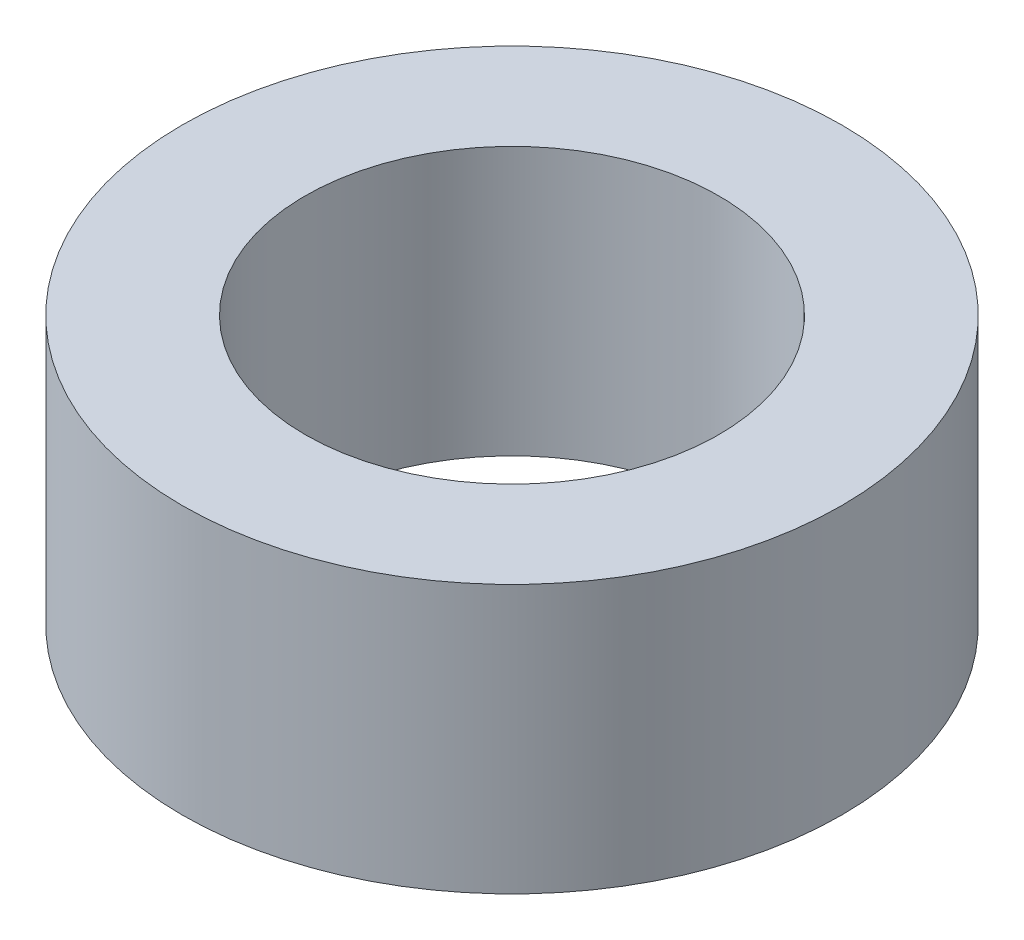
ISO-10303-21;
HEADER;
FILE_DESCRIPTION(('STEP AP214'),'2;1');
FILE_NAME('part.step','',(''),(''),'','','');
FILE_SCHEMA(('AUTOMOTIVE_DESIGN { 1 0 10303 214 1 1 1 1 }'));
ENDSEC;
DATA;
#1=APPLICATION_CONTEXT('core data for automotive mechanical design processes');
#2=APPLICATION_PROTOCOL_DEFINITION('international standard','automotive_design',2000,#1);
#3=PRODUCT_CONTEXT('',#1,'mechanical');
#4=PRODUCT('Part','Part','',(#3));
#5=PRODUCT_RELATED_PRODUCT_CATEGORY('part','',(#4));
#6=PRODUCT_DEFINITION_FORMATION('','',#4);
#7=PRODUCT_DEFINITION_CONTEXT('part definition',#1,'design');
#8=PRODUCT_DEFINITION('design','',#6,#7);
#9=PRODUCT_DEFINITION_SHAPE('','',#8);
#10=(LENGTH_UNIT() NAMED_UNIT(*) SI_UNIT(.MILLI.,.METRE.));
#11=(NAMED_UNIT(*) PLANE_ANGLE_UNIT() SI_UNIT($,.RADIAN.));
#12=(NAMED_UNIT(*) SI_UNIT($,.STERADIAN.) SOLID_ANGLE_UNIT());
#13=UNCERTAINTY_MEASURE_WITH_UNIT(LENGTH_MEASURE(1.E-05),#10,'distance_accuracy_value','');
#14=(GEOMETRIC_REPRESENTATION_CONTEXT(3) GLOBAL_UNCERTAINTY_ASSIGNED_CONTEXT((#13)) GLOBAL_UNIT_ASSIGNED_CONTEXT((#10,
#11,#12)) REPRESENTATION_CONTEXT('',''));
#15=CARTESIAN_POINT('',(0.,0.,0.));
#16=DIRECTION('',(0.,0.,1.));
#17=DIRECTION('',(1.,0.,0.));
#18=AXIS2_PLACEMENT_3D('',#15,#16,#17);
#19=CARTESIAN_POINT('',(0.,3.,0.));
#20=DIRECTION('',(0.,-1.,0.));
#21=DIRECTION('',(0.,0.,-1.));
#22=AXIS2_PLACEMENT_3D('',#19,#20,#21);
#23=CYLINDRICAL_SURFACE('',#22,3.69);
#24=CARTESIAN_POINT('',(0.,3.,0.));
#25=DIRECTION('',(0.,1.,0.));
#26=DIRECTION('',(0.,0.,1.));
#27=AXIS2_PLACEMENT_3D('',#24,#25,#26);
#28=CIRCLE('',#27,3.69);
#29=CARTESIAN_POINT('',(0.,3.,3.69));
#30=VERTEX_POINT('',#29);
#31=EDGE_CURVE('E10',#30,#30,#28,.T.);
#32=ORIENTED_EDGE('',*,*,#31,.F.);
#33=EDGE_LOOP('',(#32));
#34=FACE_BOUND('',#33,.T.);
#35=CARTESIAN_POINT('',(0.,0.,0.));
#36=DIRECTION('',(0.,1.,0.));
#37=DIRECTION('',(0.,0.,1.));
#38=AXIS2_PLACEMENT_3D('',#35,#36,#37);
#39=CIRCLE('',#38,3.69);
#40=CARTESIAN_POINT('',(0.,0.,3.69));
#41=VERTEX_POINT('',#40);
#42=EDGE_CURVE('E40',#41,#41,#39,.T.);
#43=ORIENTED_EDGE('',*,*,#42,.T.);
#44=EDGE_LOOP('',(#43));
#45=FACE_BOUND('',#44,.T.);
#46=ADVANCED_FACE('F37',(#34,#45),#23,.T.);
#47=CARTESIAN_POINT('',(0.,3.,0.));
#48=DIRECTION('',(0.,1.,0.));
#49=DIRECTION('',(0.,0.,1.));
#50=AXIS2_PLACEMENT_3D('',#47,#48,#49);
#51=PLANE('',#50);
#52=CARTESIAN_POINT('',(0.,3.,0.));
#53=DIRECTION('',(0.,1.,0.));
#54=DIRECTION('',(0.,0.,1.));
#55=AXIS2_PLACEMENT_3D('',#52,#53,#54);
#56=CIRCLE('',#55,2.31525080090715);
#57=CARTESIAN_POINT('',(0.,3.,2.31525080090715));
#58=VERTEX_POINT('',#57);
#59=EDGE_CURVE('E51',#58,#58,#56,.T.);
#60=ORIENTED_EDGE('',*,*,#59,.F.);
#61=EDGE_LOOP('',(#60));
#62=FACE_BOUND('',#61,.T.);
#63=ORIENTED_EDGE('',*,*,#31,.T.);
#64=EDGE_LOOP('',(#63));
#65=FACE_BOUND('',#64,.T.);
#66=ADVANCED_FACE('F68',(#62,#65),#51,.T.);
#67=CARTESIAN_POINT('',(0.,0.,0.));
#68=DIRECTION('',(0.,1.,0.));
#69=DIRECTION('',(0.,0.,1.));
#70=AXIS2_PLACEMENT_3D('',#67,#68,#69);
#71=PLANE('',#70);
#72=CARTESIAN_POINT('',(0.,0.,0.));
#73=DIRECTION('',(0.,1.,0.));
#74=DIRECTION('',(0.,0.,1.));
#75=AXIS2_PLACEMENT_3D('',#72,#73,#74);
#76=CIRCLE('',#75,2.31525080090715);
#77=CARTESIAN_POINT('',(0.,0.,2.31525080090715));
#78=VERTEX_POINT('',#77);
#79=EDGE_CURVE('E49',#78,#78,#76,.T.);
#80=ORIENTED_EDGE('',*,*,#79,.T.);
#81=EDGE_LOOP('',(#80));
#82=FACE_BOUND('',#81,.T.);
#83=ORIENTED_EDGE('',*,*,#42,.F.);
#84=EDGE_LOOP('',(#83));
#85=FACE_BOUND('',#84,.T.);
#86=ADVANCED_FACE('F59',(#82,#85),#71,.F.);
#87=CARTESIAN_POINT('',(0.,0.,0.));
#88=DIRECTION('',(0.,1.,0.));
#89=DIRECTION('',(0.,0.,1.));
#90=AXIS2_PLACEMENT_3D('',#87,#88,#89);
#91=CYLINDRICAL_SURFACE('',#90,2.31525080090715);
#92=ORIENTED_EDGE('',*,*,#79,.F.);
#93=EDGE_LOOP('',(#92));
#94=FACE_BOUND('',#93,.T.);
#95=ORIENTED_EDGE('',*,*,#59,.T.);
#96=EDGE_LOOP('',(#95));
#97=FACE_BOUND('',#96,.T.);
#98=ADVANCED_FACE('F62',(#94,#97),#91,.F.);
#99=CLOSED_SHELL('',(#46,#66,#86,#98));
#100=MANIFOLD_SOLID_BREP('B2',#99);
#101=ADVANCED_BREP_SHAPE_REPRESENTATION('',(#18,#100),#14);
#102=SHAPE_DEFINITION_REPRESENTATION(#9,#101);
ENDSEC;
END-ISO-10303-21;
